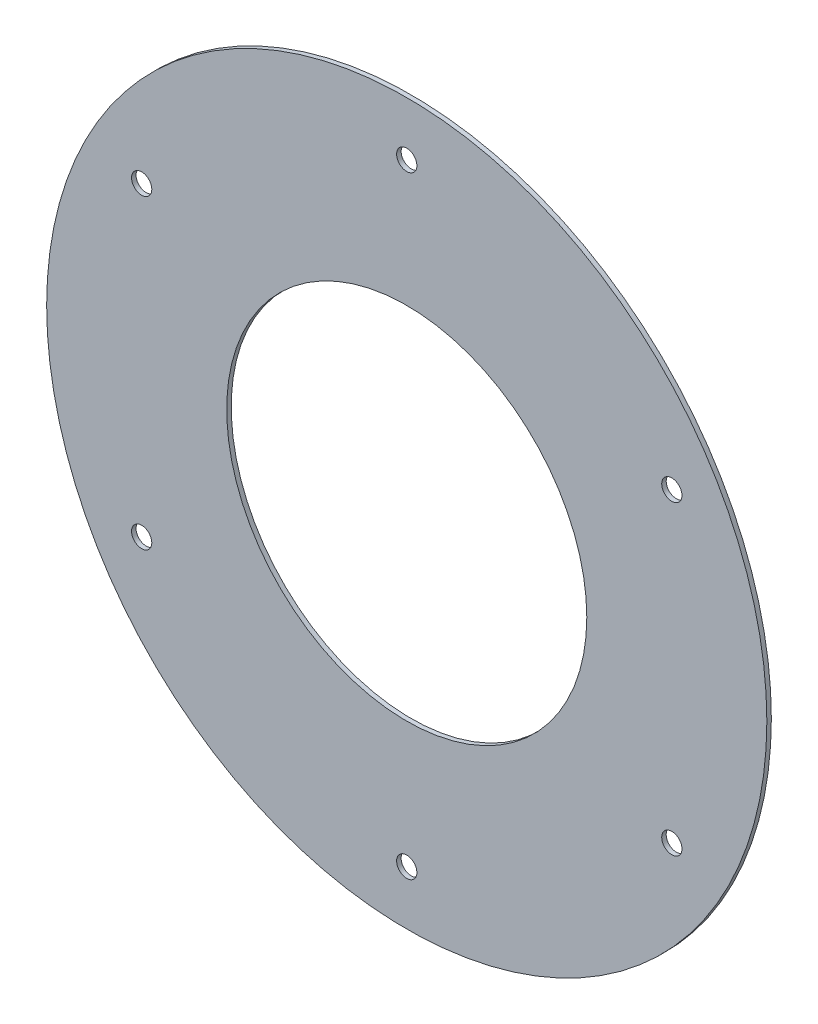
ISO-10303-21;
HEADER;
FILE_DESCRIPTION(('STEP AP214'),'2;1');
FILE_NAME('part.step','',(''),(''),'','','');
FILE_SCHEMA(('AUTOMOTIVE_DESIGN { 1 0 10303 214 1 1 1 1 }'));
ENDSEC;
DATA;
#1=APPLICATION_CONTEXT('core data for automotive mechanical design processes');
#2=APPLICATION_PROTOCOL_DEFINITION('international standard','automotive_design',2000,#1);
#3=PRODUCT_CONTEXT('',#1,'mechanical');
#4=PRODUCT('Part','Part','',(#3));
#5=PRODUCT_RELATED_PRODUCT_CATEGORY('part','',(#4));
#6=PRODUCT_DEFINITION_FORMATION('','',#4);
#7=PRODUCT_DEFINITION_CONTEXT('part definition',#1,'design');
#8=PRODUCT_DEFINITION('design','',#6,#7);
#9=PRODUCT_DEFINITION_SHAPE('','',#8);
#10=(LENGTH_UNIT() NAMED_UNIT(*) SI_UNIT(.MILLI.,.METRE.));
#11=(NAMED_UNIT(*) PLANE_ANGLE_UNIT() SI_UNIT($,.RADIAN.));
#12=(NAMED_UNIT(*) SI_UNIT($,.STERADIAN.) SOLID_ANGLE_UNIT());
#13=UNCERTAINTY_MEASURE_WITH_UNIT(LENGTH_MEASURE(1.E-05),#10,'distance_accuracy_value','');
#14=(GEOMETRIC_REPRESENTATION_CONTEXT(3) GLOBAL_UNCERTAINTY_ASSIGNED_CONTEXT((#13)) GLOBAL_UNIT_ASSIGNED_CONTEXT((#10,
#11,#12)) REPRESENTATION_CONTEXT('',''));
#15=CARTESIAN_POINT('',(0.,0.,0.));
#16=DIRECTION('',(0.,0.,1.));
#17=DIRECTION('',(1.,0.,0.));
#18=AXIS2_PLACEMENT_3D('',#15,#16,#17);
#19=CARTESIAN_POINT('',(0.,0.,1.5875));
#20=DIRECTION('',(0.,0.,-1.));
#21=DIRECTION('',(-1.,0.,0.));
#22=AXIS2_PLACEMENT_3D('',#19,#20,#21);
#23=CYLINDRICAL_SURFACE('',#22,127.);
#24=CARTESIAN_POINT('',(0.,0.,1.5875));
#25=DIRECTION('',(0.,0.,1.));
#26=DIRECTION('',(1.,0.,0.));
#27=AXIS2_PLACEMENT_3D('',#24,#25,#26);
#28=CIRCLE('',#27,127.);
#29=CARTESIAN_POINT('',(127.,0.,1.5875));
#30=VERTEX_POINT('',#29);
#31=EDGE_CURVE('E12',#30,#30,#28,.T.);
#32=ORIENTED_EDGE('',*,*,#31,.F.);
#33=EDGE_LOOP('',(#32));
#34=FACE_BOUND('',#33,.T.);
#35=CARTESIAN_POINT('',(0.,0.,0.));
#36=DIRECTION('',(0.,0.,1.));
#37=DIRECTION('',(1.,0.,0.));
#38=AXIS2_PLACEMENT_3D('',#35,#36,#37);
#39=CIRCLE('',#38,127.);
#40=CARTESIAN_POINT('',(127.,0.,0.));
#41=VERTEX_POINT('',#40);
#42=EDGE_CURVE('E60',#41,#41,#39,.T.);
#43=ORIENTED_EDGE('',*,*,#42,.T.);
#44=EDGE_LOOP('',(#43));
#45=FACE_BOUND('',#44,.T.);
#46=ADVANCED_FACE('F57',(#34,#45),#23,.T.);
#47=CARTESIAN_POINT('',(0.,0.,1.5875));
#48=DIRECTION('',(0.,0.,1.));
#49=DIRECTION('',(1.,0.,0.));
#50=AXIS2_PLACEMENT_3D('',#47,#48,#49);
#51=PLANE('',#50);
#52=CARTESIAN_POINT('',(0.,0.,1.5875));
#53=DIRECTION('',(0.,0.,1.));
#54=DIRECTION('',(1.,0.,0.));
#55=AXIS2_PLACEMENT_3D('',#52,#53,#54);
#56=CIRCLE('',#55,63.5);
#57=CARTESIAN_POINT('',(63.5,0.,1.5875));
#58=VERTEX_POINT('',#57);
#59=EDGE_CURVE('E124',#58,#58,#56,.T.);
#60=ORIENTED_EDGE('',*,*,#59,.F.);
#61=EDGE_LOOP('',(#60));
#62=FACE_BOUND('',#61,.T.);
#63=CARTESIAN_POINT('',(0.,107.95,1.5875));
#64=DIRECTION('',(0.,0.,1.));
#65=DIRECTION('',(1.,0.,0.));
#66=AXIS2_PLACEMENT_3D('',#63,#64,#65);
#67=CIRCLE('',#66,3.57124);
#68=CARTESIAN_POINT('',(3.57124,107.95,1.5875));
#69=VERTEX_POINT('',#68);
#70=EDGE_CURVE('E116',#69,#69,#67,.T.);
#71=ORIENTED_EDGE('',*,*,#70,.F.);
#72=EDGE_LOOP('',(#71));
#73=FACE_BOUND('',#72,.T.);
#74=CARTESIAN_POINT('',(93.4874423385301,53.975,1.5875));
#75=DIRECTION('',(0.,0.,1.));
#76=DIRECTION('',(1.,0.,0.));
#77=AXIS2_PLACEMENT_3D('',#74,#75,#76);
#78=CIRCLE('',#77,3.57124);
#79=CARTESIAN_POINT('',(97.0586823385301,53.975,1.5875));
#80=VERTEX_POINT('',#79);
#81=EDGE_CURVE('E108',#80,#80,#78,.T.);
#82=ORIENTED_EDGE('',*,*,#81,.F.);
#83=EDGE_LOOP('',(#82));
#84=FACE_BOUND('',#83,.T.);
#85=CARTESIAN_POINT('',(93.4874423385302,-53.975,1.5875));
#86=DIRECTION('',(0.,0.,1.));
#87=DIRECTION('',(1.,0.,0.));
#88=AXIS2_PLACEMENT_3D('',#85,#86,#87);
#89=CIRCLE('',#88,3.57124);
#90=CARTESIAN_POINT('',(97.0586823385302,-53.975,1.5875));
#91=VERTEX_POINT('',#90);
#92=EDGE_CURVE('E100',#91,#91,#89,.T.);
#93=ORIENTED_EDGE('',*,*,#92,.F.);
#94=EDGE_LOOP('',(#93));
#95=FACE_BOUND('',#94,.T.);
#96=CARTESIAN_POINT('',(0.,-107.95,1.5875));
#97=DIRECTION('',(0.,0.,1.));
#98=DIRECTION('',(1.,0.,0.));
#99=AXIS2_PLACEMENT_3D('',#96,#97,#98);
#100=CIRCLE('',#99,3.57124);
#101=CARTESIAN_POINT('',(3.57124000000001,-107.95,1.5875));
#102=VERTEX_POINT('',#101);
#103=EDGE_CURVE('E92',#102,#102,#100,.T.);
#104=ORIENTED_EDGE('',*,*,#103,.F.);
#105=EDGE_LOOP('',(#104));
#106=FACE_BOUND('',#105,.T.);
#107=CARTESIAN_POINT('',(-93.4874423385301,-53.975,1.5875));
#108=DIRECTION('',(0.,0.,1.));
#109=DIRECTION('',(1.,0.,0.));
#110=AXIS2_PLACEMENT_3D('',#107,#108,#109);
#111=CIRCLE('',#110,3.57124);
#112=CARTESIAN_POINT('',(-89.9162023385301,-53.975,1.5875));
#113=VERTEX_POINT('',#112);
#114=EDGE_CURVE('E84',#113,#113,#111,.T.);
#115=ORIENTED_EDGE('',*,*,#114,.F.);
#116=EDGE_LOOP('',(#115));
#117=FACE_BOUND('',#116,.T.);
#118=CARTESIAN_POINT('',(-93.4874423385302,53.975,1.5875));
#119=DIRECTION('',(0.,0.,1.));
#120=DIRECTION('',(1.,0.,0.));
#121=AXIS2_PLACEMENT_3D('',#118,#119,#120);
#122=CIRCLE('',#121,3.57124);
#123=CARTESIAN_POINT('',(-89.9162023385302,53.975,1.5875));
#124=VERTEX_POINT('',#123);
#125=EDGE_CURVE('E76',#124,#124,#122,.T.);
#126=ORIENTED_EDGE('',*,*,#125,.F.);
#127=EDGE_LOOP('',(#126));
#128=FACE_BOUND('',#127,.T.);
#129=ORIENTED_EDGE('',*,*,#31,.T.);
#130=EDGE_LOOP('',(#129));
#131=FACE_BOUND('',#130,.T.);
#132=ADVANCED_FACE('F134',(#62,#73,#84,#95,#106,#117,#128,#131),#51,.T.);
#133=CARTESIAN_POINT('',(0.,0.,0.));
#134=DIRECTION('',(0.,0.,1.));
#135=DIRECTION('',(1.,0.,0.));
#136=AXIS2_PLACEMENT_3D('',#133,#134,#135);
#137=PLANE('',#136);
#138=CARTESIAN_POINT('',(0.,0.,0.));
#139=DIRECTION('',(0.,0.,1.));
#140=DIRECTION('',(1.,0.,0.));
#141=AXIS2_PLACEMENT_3D('',#138,#139,#140);
#142=CIRCLE('',#141,63.5);
#143=CARTESIAN_POINT('',(63.5,0.,0.));
#144=VERTEX_POINT('',#143);
#145=EDGE_CURVE('E120',#144,#144,#142,.F.);
#146=ORIENTED_EDGE('',*,*,#145,.F.);
#147=EDGE_LOOP('',(#146));
#148=FACE_BOUND('',#147,.T.);
#149=CARTESIAN_POINT('',(0.,107.95,0.));
#150=DIRECTION('',(0.,0.,1.));
#151=DIRECTION('',(1.,0.,0.));
#152=AXIS2_PLACEMENT_3D('',#149,#150,#151);
#153=CIRCLE('',#152,3.57124);
#154=CARTESIAN_POINT('',(3.57124,107.95,0.));
#155=VERTEX_POINT('',#154);
#156=EDGE_CURVE('E112',#155,#155,#153,.T.);
#157=ORIENTED_EDGE('',*,*,#156,.T.);
#158=EDGE_LOOP('',(#157));
#159=FACE_BOUND('',#158,.T.);
#160=CARTESIAN_POINT('',(93.4874423385301,53.975,0.));
#161=DIRECTION('',(0.,0.,1.));
#162=DIRECTION('',(1.,0.,0.));
#163=AXIS2_PLACEMENT_3D('',#160,#161,#162);
#164=CIRCLE('',#163,3.57124);
#165=CARTESIAN_POINT('',(97.0586823385301,53.975,0.));
#166=VERTEX_POINT('',#165);
#167=EDGE_CURVE('E104',#166,#166,#164,.T.);
#168=ORIENTED_EDGE('',*,*,#167,.T.);
#169=EDGE_LOOP('',(#168));
#170=FACE_BOUND('',#169,.T.);
#171=CARTESIAN_POINT('',(93.4874423385302,-53.975,0.));
#172=DIRECTION('',(0.,0.,1.));
#173=DIRECTION('',(1.,0.,0.));
#174=AXIS2_PLACEMENT_3D('',#171,#172,#173);
#175=CIRCLE('',#174,3.57124);
#176=CARTESIAN_POINT('',(97.0586823385302,-53.975,0.));
#177=VERTEX_POINT('',#176);
#178=EDGE_CURVE('E96',#177,#177,#175,.T.);
#179=ORIENTED_EDGE('',*,*,#178,.T.);
#180=EDGE_LOOP('',(#179));
#181=FACE_BOUND('',#180,.T.);
#182=CARTESIAN_POINT('',(0.,-107.95,0.));
#183=DIRECTION('',(0.,0.,1.));
#184=DIRECTION('',(1.,0.,0.));
#185=AXIS2_PLACEMENT_3D('',#182,#183,#184);
#186=CIRCLE('',#185,3.57124);
#187=CARTESIAN_POINT('',(3.57124000000001,-107.95,0.));
#188=VERTEX_POINT('',#187);
#189=EDGE_CURVE('E88',#188,#188,#186,.T.);
#190=ORIENTED_EDGE('',*,*,#189,.T.);
#191=EDGE_LOOP('',(#190));
#192=FACE_BOUND('',#191,.T.);
#193=CARTESIAN_POINT('',(-93.4874423385301,-53.975,0.));
#194=DIRECTION('',(0.,0.,1.));
#195=DIRECTION('',(1.,0.,0.));
#196=AXIS2_PLACEMENT_3D('',#193,#194,#195);
#197=CIRCLE('',#196,3.57124);
#198=CARTESIAN_POINT('',(-89.9162023385301,-53.975,0.));
#199=VERTEX_POINT('',#198);
#200=EDGE_CURVE('E80',#199,#199,#197,.T.);
#201=ORIENTED_EDGE('',*,*,#200,.T.);
#202=EDGE_LOOP('',(#201));
#203=FACE_BOUND('',#202,.T.);
#204=CARTESIAN_POINT('',(-93.4874423385302,53.975,0.));
#205=DIRECTION('',(0.,0.,1.));
#206=DIRECTION('',(1.,0.,0.));
#207=AXIS2_PLACEMENT_3D('',#204,#205,#206);
#208=CIRCLE('',#207,3.57124);
#209=CARTESIAN_POINT('',(-89.9162023385302,53.975,0.));
#210=VERTEX_POINT('',#209);
#211=EDGE_CURVE('E71',#210,#210,#208,.T.);
#212=ORIENTED_EDGE('',*,*,#211,.T.);
#213=EDGE_LOOP('',(#212));
#214=FACE_BOUND('',#213,.T.);
#215=ORIENTED_EDGE('',*,*,#42,.F.);
#216=EDGE_LOOP('',(#215));
#217=FACE_BOUND('',#216,.T.);
#218=ADVANCED_FACE('F137',(#148,#159,#170,#181,#192,#203,#214,#217),#137,.F.);
#219=CARTESIAN_POINT('',(-93.4874423385302,53.975,1.5875));
#220=DIRECTION('',(0.,0.,1.));
#221=DIRECTION('',(1.,0.,0.));
#222=AXIS2_PLACEMENT_3D('',#219,#220,#221);
#223=CYLINDRICAL_SURFACE('',#222,3.57124);
#224=ORIENTED_EDGE('',*,*,#211,.F.);
#225=EDGE_LOOP('',(#224));
#226=FACE_BOUND('',#225,.T.);
#227=ORIENTED_EDGE('',*,*,#125,.T.);
#228=EDGE_LOOP('',(#227));
#229=FACE_BOUND('',#228,.T.);
#230=ADVANCED_FACE('F151',(#226,#229),#223,.F.);
#231=CARTESIAN_POINT('',(-93.4874423385301,-53.975,1.5875));
#232=DIRECTION('',(0.,0.,1.));
#233=DIRECTION('',(1.,0.,0.));
#234=AXIS2_PLACEMENT_3D('',#231,#232,#233);
#235=CYLINDRICAL_SURFACE('',#234,3.57124);
#236=ORIENTED_EDGE('',*,*,#200,.F.);
#237=EDGE_LOOP('',(#236));
#238=FACE_BOUND('',#237,.T.);
#239=ORIENTED_EDGE('',*,*,#114,.T.);
#240=EDGE_LOOP('',(#239));
#241=FACE_BOUND('',#240,.T.);
#242=ADVANCED_FACE('F153',(#238,#241),#235,.F.);
#243=CARTESIAN_POINT('',(0.,-107.95,1.5875));
#244=DIRECTION('',(0.,0.,1.));
#245=DIRECTION('',(1.,0.,0.));
#246=AXIS2_PLACEMENT_3D('',#243,#244,#245);
#247=CYLINDRICAL_SURFACE('',#246,3.57124);
#248=ORIENTED_EDGE('',*,*,#189,.F.);
#249=EDGE_LOOP('',(#248));
#250=FACE_BOUND('',#249,.T.);
#251=ORIENTED_EDGE('',*,*,#103,.T.);
#252=EDGE_LOOP('',(#251));
#253=FACE_BOUND('',#252,.T.);
#254=ADVANCED_FACE('F160',(#250,#253),#247,.F.);
#255=CARTESIAN_POINT('',(93.4874423385302,-53.975,1.5875));
#256=DIRECTION('',(0.,0.,1.));
#257=DIRECTION('',(1.,0.,0.));
#258=AXIS2_PLACEMENT_3D('',#255,#256,#257);
#259=CYLINDRICAL_SURFACE('',#258,3.57124);
#260=ORIENTED_EDGE('',*,*,#178,.F.);
#261=EDGE_LOOP('',(#260));
#262=FACE_BOUND('',#261,.T.);
#263=ORIENTED_EDGE('',*,*,#92,.T.);
#264=EDGE_LOOP('',(#263));
#265=FACE_BOUND('',#264,.T.);
#266=ADVANCED_FACE('F206',(#262,#265),#259,.F.);
#267=CARTESIAN_POINT('',(93.4874423385301,53.975,1.5875));
#268=DIRECTION('',(0.,0.,1.));
#269=DIRECTION('',(1.,0.,0.));
#270=AXIS2_PLACEMENT_3D('',#267,#268,#269);
#271=CYLINDRICAL_SURFACE('',#270,3.57124);
#272=ORIENTED_EDGE('',*,*,#167,.F.);
#273=EDGE_LOOP('',(#272));
#274=FACE_BOUND('',#273,.T.);
#275=ORIENTED_EDGE('',*,*,#81,.T.);
#276=EDGE_LOOP('',(#275));
#277=FACE_BOUND('',#276,.T.);
#278=ADVANCED_FACE('F216',(#274,#277),#271,.F.);
#279=CARTESIAN_POINT('',(0.,107.95,1.5875));
#280=DIRECTION('',(0.,0.,1.));
#281=DIRECTION('',(1.,0.,0.));
#282=AXIS2_PLACEMENT_3D('',#279,#280,#281);
#283=CYLINDRICAL_SURFACE('',#282,3.57124);
#284=ORIENTED_EDGE('',*,*,#156,.F.);
#285=EDGE_LOOP('',(#284));
#286=FACE_BOUND('',#285,.T.);
#287=ORIENTED_EDGE('',*,*,#70,.T.);
#288=EDGE_LOOP('',(#287));
#289=FACE_BOUND('',#288,.T.);
#290=ADVANCED_FACE('F226',(#286,#289),#283,.F.);
#291=CARTESIAN_POINT('',(0.,0.,-0.000999999999999916));
#292=DIRECTION('',(0.,0.,1.));
#293=DIRECTION('',(1.,0.,0.));
#294=AXIS2_PLACEMENT_3D('',#291,#292,#293);
#295=CYLINDRICAL_SURFACE('',#294,63.5);
#296=ORIENTED_EDGE('',*,*,#59,.T.);
#297=EDGE_LOOP('',(#296));
#298=FACE_BOUND('',#297,.T.);
#299=ORIENTED_EDGE('',*,*,#145,.T.);
#300=EDGE_LOOP('',(#299));
#301=FACE_BOUND('',#300,.T.);
#302=ADVANCED_FACE('F131',(#298,#301),#295,.F.);
#303=CLOSED_SHELL('',(#46,#132,#218,#230,#242,#254,#266,#278,#290,#302));
#304=MANIFOLD_SOLID_BREP('B2',#303);
#305=ADVANCED_BREP_SHAPE_REPRESENTATION('',(#18,#304),#14);
#306=SHAPE_DEFINITION_REPRESENTATION(#9,#305);
ENDSEC;
END-ISO-10303-21;
